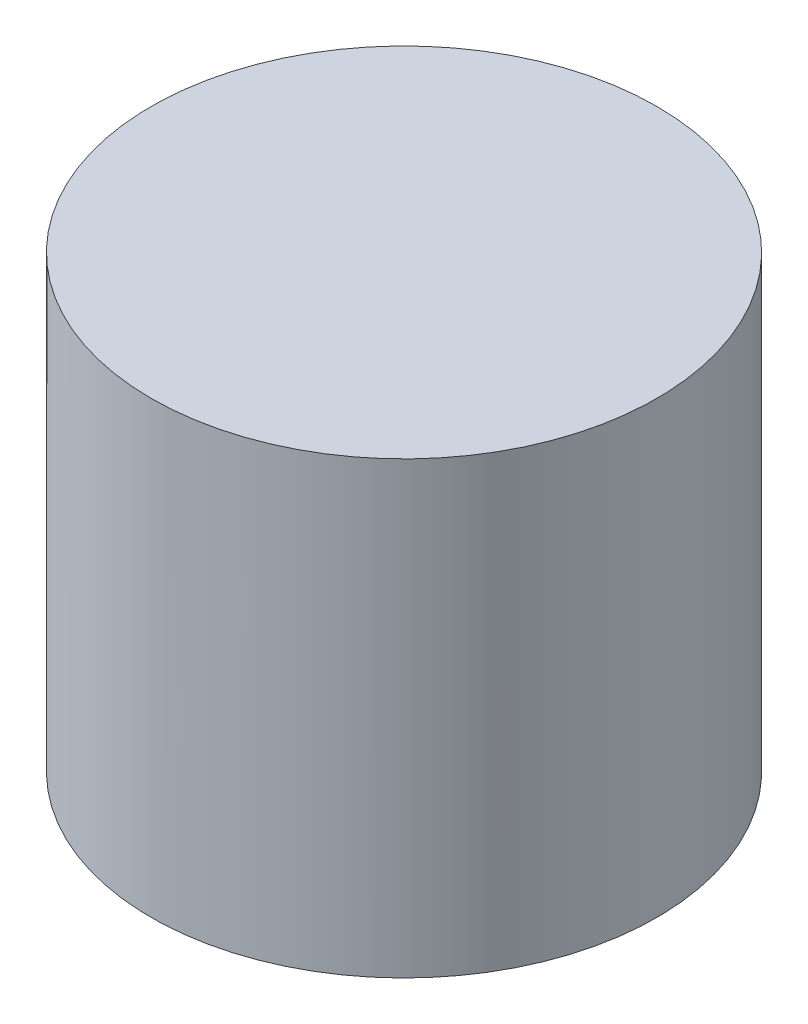
ISO-10303-21;
HEADER;
FILE_DESCRIPTION(('STEP AP214'),'2;1');
FILE_NAME('part.step','',(''),(''),'','','');
FILE_SCHEMA(('AUTOMOTIVE_DESIGN { 1 0 10303 214 1 1 1 1 }'));
ENDSEC;
DATA;
#1=APPLICATION_CONTEXT('core data for automotive mechanical design processes');
#2=APPLICATION_PROTOCOL_DEFINITION('international standard','automotive_design',2000,#1);
#3=PRODUCT_CONTEXT('',#1,'mechanical');
#4=PRODUCT('Part','Part','',(#3));
#5=PRODUCT_RELATED_PRODUCT_CATEGORY('part','',(#4));
#6=PRODUCT_DEFINITION_FORMATION('','',#4);
#7=PRODUCT_DEFINITION_CONTEXT('part definition',#1,'design');
#8=PRODUCT_DEFINITION('design','',#6,#7);
#9=PRODUCT_DEFINITION_SHAPE('','',#8);
#10=(LENGTH_UNIT() NAMED_UNIT(*) SI_UNIT(.MILLI.,.METRE.));
#11=(NAMED_UNIT(*) PLANE_ANGLE_UNIT() SI_UNIT($,.RADIAN.));
#12=(NAMED_UNIT(*) SI_UNIT($,.STERADIAN.) SOLID_ANGLE_UNIT());
#13=UNCERTAINTY_MEASURE_WITH_UNIT(LENGTH_MEASURE(1.E-05),#10,'distance_accuracy_value','');
#14=(GEOMETRIC_REPRESENTATION_CONTEXT(3) GLOBAL_UNCERTAINTY_ASSIGNED_CONTEXT((#13)) GLOBAL_UNIT_ASSIGNED_CONTEXT((#10,
#11,#12)) REPRESENTATION_CONTEXT('',''));
#15=CARTESIAN_POINT('',(0.,0.,0.));
#16=DIRECTION('',(0.,0.,1.));
#17=DIRECTION('',(1.,0.,0.));
#18=AXIS2_PLACEMENT_3D('',#15,#16,#17);
#19=CARTESIAN_POINT('',(0.,-37.,0.));
#20=DIRECTION('',(0.,1.,0.));
#21=DIRECTION('',(0.,0.,1.));
#22=AXIS2_PLACEMENT_3D('',#19,#20,#21);
#23=CYLINDRICAL_SURFACE('',#22,18.);
#24=CARTESIAN_POINT('',(0.,-32.0250628144669,0.));
#25=DIRECTION('',(0.,-1.,0.));
#26=DIRECTION('',(0.,0.,-1.));
#27=AXIS2_PLACEMENT_3D('',#24,#25,#26);
#28=CIRCLE('',#27,18.);
#29=CARTESIAN_POINT('',(0.,-32.0250628144669,-18.));
#30=VERTEX_POINT('',#29);
#31=EDGE_CURVE('E42',#30,#30,#28,.T.);
#32=ORIENTED_EDGE('',*,*,#31,.T.);
#33=EDGE_LOOP('',(#32));
#34=FACE_BOUND('',#33,.T.);
#35=CARTESIAN_POINT('',(0.,-3.,0.));
#36=DIRECTION('',(0.,1.,0.));
#37=DIRECTION('',(0.,0.,1.));
#38=AXIS2_PLACEMENT_3D('',#35,#36,#37);
#39=CIRCLE('',#38,18.);
#40=CARTESIAN_POINT('',(0.,-3.,18.));
#41=VERTEX_POINT('',#40);
#42=EDGE_CURVE('E55',#41,#41,#39,.T.);
#43=ORIENTED_EDGE('',*,*,#42,.T.);
#44=EDGE_LOOP('',(#43));
#45=FACE_BOUND('',#44,.T.);
#46=ADVANCED_FACE('F35',(#34,#45),#23,.F.);
#47=CARTESIAN_POINT('',(0.,3.,0.));
#48=DIRECTION('',(0.,-1.,0.));
#49=DIRECTION('',(0.,0.,-1.));
#50=AXIS2_PLACEMENT_3D('',#47,#48,#49);
#51=CYLINDRICAL_SURFACE('',#50,22.5);
#52=CARTESIAN_POINT('',(0.,3.,0.));
#53=DIRECTION('',(0.,1.,0.));
#54=DIRECTION('',(0.,0.,1.));
#55=AXIS2_PLACEMENT_3D('',#52,#53,#54);
#56=CIRCLE('',#55,22.5);
#57=CARTESIAN_POINT('',(0.,3.,22.5));
#58=VERTEX_POINT('',#57);
#59=EDGE_CURVE('E46',#58,#58,#56,.T.);
#60=ORIENTED_EDGE('',*,*,#59,.F.);
#61=EDGE_LOOP('',(#60));
#62=FACE_BOUND('',#61,.T.);
#63=CARTESIAN_POINT('',(0.,-37.,0.));
#64=DIRECTION('',(0.,-1.,0.));
#65=DIRECTION('',(0.,0.,-1.));
#66=AXIS2_PLACEMENT_3D('',#63,#64,#65);
#67=CIRCLE('',#66,22.5);
#68=CARTESIAN_POINT('',(0.,-37.,-22.5));
#69=VERTEX_POINT('',#68);
#70=EDGE_CURVE('E50',#69,#69,#67,.T.);
#71=ORIENTED_EDGE('',*,*,#70,.F.);
#72=EDGE_LOOP('',(#71));
#73=FACE_BOUND('',#72,.T.);
#74=ADVANCED_FACE('F77',(#62,#73),#51,.T.);
#75=CARTESIAN_POINT('',(0.,3.,0.));
#76=DIRECTION('',(0.,1.,0.));
#77=DIRECTION('',(0.,0.,1.));
#78=AXIS2_PLACEMENT_3D('',#75,#76,#77);
#79=PLANE('',#78);
#80=ORIENTED_EDGE('',*,*,#59,.T.);
#81=EDGE_LOOP('',(#80));
#82=FACE_BOUND('',#81,.T.);
#83=ADVANCED_FACE('F74',(#82),#79,.T.);
#84=CARTESIAN_POINT('',(0.,-32.0250628144669,0.));
#85=DIRECTION('',(0.,-1.,0.));
#86=DIRECTION('',(0.,0.,-1.));
#87=AXIS2_PLACEMENT_3D('',#84,#85,#86);
#88=TOROIDAL_SURFACE('',#87,23.,5.);
#89=ORIENTED_EDGE('',*,*,#70,.T.);
#90=EDGE_LOOP('',(#89));
#91=FACE_BOUND('',#90,.T.);
#92=ORIENTED_EDGE('',*,*,#31,.F.);
#93=EDGE_LOOP('',(#92));
#94=FACE_BOUND('',#93,.T.);
#95=ADVANCED_FACE('F37',(#91,#94),#88,.T.);
#96=CARTESIAN_POINT('',(0.,-3.,0.));
#97=DIRECTION('',(0.,1.,0.));
#98=DIRECTION('',(0.,0.,1.));
#99=AXIS2_PLACEMENT_3D('',#96,#97,#98);
#100=CYLINDRICAL_SURFACE('',#99,17.1);
#101=CARTESIAN_POINT('',(0.,-3.,0.));
#102=DIRECTION('',(0.,1.,0.));
#103=DIRECTION('',(0.,0.,1.));
#104=AXIS2_PLACEMENT_3D('',#101,#102,#103);
#105=CIRCLE('',#104,17.1);
#106=CARTESIAN_POINT('',(0.,-3.,17.1));
#107=VERTEX_POINT('',#106);
#108=EDGE_CURVE('E58',#107,#107,#105,.T.);
#109=ORIENTED_EDGE('',*,*,#108,.F.);
#110=EDGE_LOOP('',(#109));
#111=FACE_BOUND('',#110,.T.);
#112=CARTESIAN_POINT('',(0.,0.,0.));
#113=DIRECTION('',(0.,1.,0.));
#114=DIRECTION('',(0.,0.,1.));
#115=AXIS2_PLACEMENT_3D('',#112,#113,#114);
#116=CIRCLE('',#115,17.1);
#117=CARTESIAN_POINT('',(0.,0.,17.1));
#118=VERTEX_POINT('',#117);
#119=EDGE_CURVE('E10',#118,#118,#116,.T.);
#120=ORIENTED_EDGE('',*,*,#119,.T.);
#121=EDGE_LOOP('',(#120));
#122=FACE_BOUND('',#121,.T.);
#123=ADVANCED_FACE('F65',(#111,#122),#100,.F.);
#124=CARTESIAN_POINT('',(0.,-3.,0.));
#125=DIRECTION('',(0.,1.,0.));
#126=DIRECTION('',(0.,0.,1.));
#127=AXIS2_PLACEMENT_3D('',#124,#125,#126);
#128=PLANE('',#127);
#129=ORIENTED_EDGE('',*,*,#108,.T.);
#130=EDGE_LOOP('',(#129));
#131=FACE_BOUND('',#130,.T.);
#132=ORIENTED_EDGE('',*,*,#42,.F.);
#133=EDGE_LOOP('',(#132));
#134=FACE_BOUND('',#133,.T.);
#135=ADVANCED_FACE('F62',(#131,#134),#128,.F.);
#136=CARTESIAN_POINT('',(0.,0.,0.));
#137=DIRECTION('',(0.,1.,0.));
#138=DIRECTION('',(0.,0.,1.));
#139=AXIS2_PLACEMENT_3D('',#136,#137,#138);
#140=PLANE('',#139);
#141=ORIENTED_EDGE('',*,*,#119,.F.);
#142=EDGE_LOOP('',(#141));
#143=FACE_BOUND('',#142,.T.);
#144=ADVANCED_FACE('F72',(#143),#140,.F.);
#145=CLOSED_SHELL('',(#46,#74,#83,#95,#123,#135,#144));
#146=MANIFOLD_SOLID_BREP('B2',#145);
#147=ADVANCED_BREP_SHAPE_REPRESENTATION('',(#18,#146),#14);
#148=SHAPE_DEFINITION_REPRESENTATION(#9,#147);
ENDSEC;
END-ISO-10303-21;
